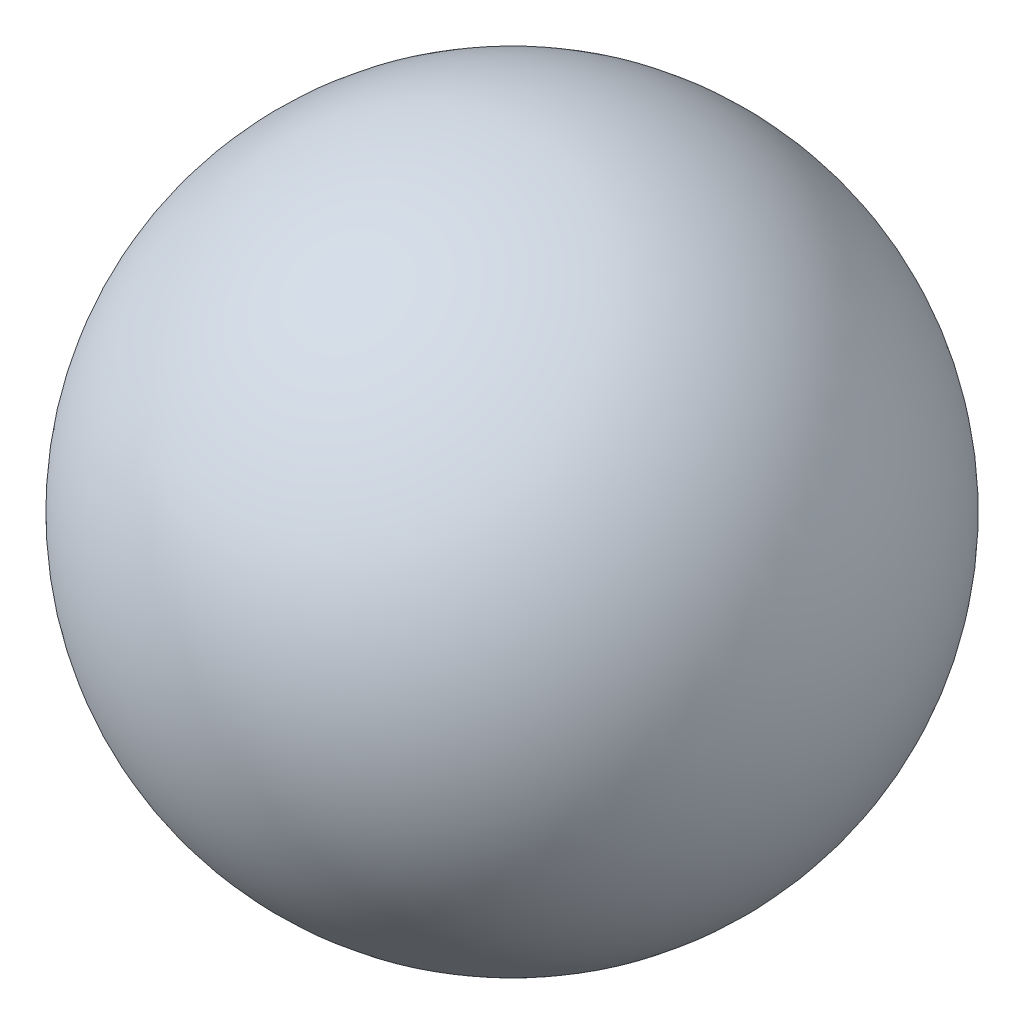
ISO-10303-21;
HEADER;
FILE_DESCRIPTION(('STEP AP214'),'2;1');
FILE_NAME('part.step','',(''),(''),'','','');
FILE_SCHEMA(('AUTOMOTIVE_DESIGN { 1 0 10303 214 1 1 1 1 }'));
ENDSEC;
DATA;
#1=APPLICATION_CONTEXT('core data for automotive mechanical design processes');
#2=APPLICATION_PROTOCOL_DEFINITION('international standard','automotive_design',2000,#1);
#3=PRODUCT_CONTEXT('',#1,'mechanical');
#4=PRODUCT('Part','Part','',(#3));
#5=PRODUCT_RELATED_PRODUCT_CATEGORY('part','',(#4));
#6=PRODUCT_DEFINITION_FORMATION('','',#4);
#7=PRODUCT_DEFINITION_CONTEXT('part definition',#1,'design');
#8=PRODUCT_DEFINITION('design','',#6,#7);
#9=PRODUCT_DEFINITION_SHAPE('','',#8);
#10=(LENGTH_UNIT() NAMED_UNIT(*) SI_UNIT(.MILLI.,.METRE.));
#11=(NAMED_UNIT(*) PLANE_ANGLE_UNIT() SI_UNIT($,.RADIAN.));
#12=(NAMED_UNIT(*) SI_UNIT($,.STERADIAN.) SOLID_ANGLE_UNIT());
#13=UNCERTAINTY_MEASURE_WITH_UNIT(LENGTH_MEASURE(1.E-05),#10,'distance_accuracy_value','');
#14=(GEOMETRIC_REPRESENTATION_CONTEXT(3) GLOBAL_UNCERTAINTY_ASSIGNED_CONTEXT((#13)) GLOBAL_UNIT_ASSIGNED_CONTEXT((#10,
#11,#12)) REPRESENTATION_CONTEXT('',''));
#15=CARTESIAN_POINT('',(0.,0.,0.));
#16=DIRECTION('',(0.,0.,1.));
#17=DIRECTION('',(1.,0.,0.));
#18=AXIS2_PLACEMENT_3D('',#15,#16,#17);
#19=CARTESIAN_POINT('',(0.,0.,0.));
#20=DIRECTION('',(0.,1.,0.));
#21=DIRECTION('',(1.,0.,0.));
#22=AXIS2_PLACEMENT_3D('',#19,#20,#21);
#23=SPHERICAL_SURFACE('',#22,12.);
#24=CARTESIAN_POINT('',(0.,12.,0.));
#25=VERTEX_POINT('',#24);
#26=VERTEX_LOOP('',#25);
#27=FACE_BOUND('',#26,.T.);
#28=ADVANCED_FACE('F29',(#27),#23,.T.);
#29=CLOSED_SHELL('',(#28));
#30=MANIFOLD_SOLID_BREP('B2',#29);
#31=ADVANCED_BREP_SHAPE_REPRESENTATION('',(#18,#30),#14);
#32=SHAPE_DEFINITION_REPRESENTATION(#9,#31);
ENDSEC;
END-ISO-10303-21;
